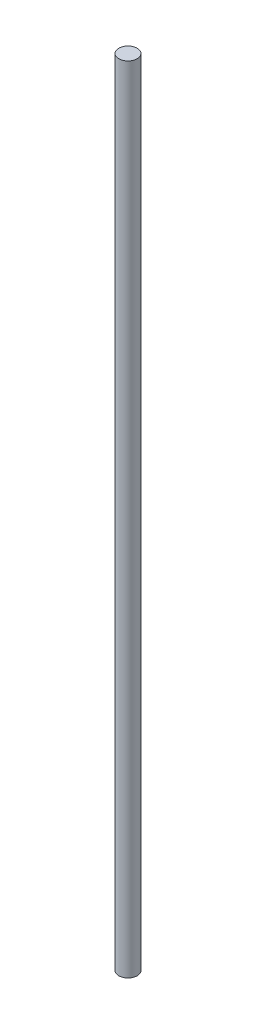
ISO-10303-21;
HEADER;
FILE_DESCRIPTION(('STEP AP214'),'2;1');
FILE_NAME('part.step','',(''),(''),'','','');
FILE_SCHEMA(('AUTOMOTIVE_DESIGN { 1 0 10303 214 1 1 1 1 }'));
ENDSEC;
DATA;
#1=APPLICATION_CONTEXT('core data for automotive mechanical design processes');
#2=APPLICATION_PROTOCOL_DEFINITION('international standard','automotive_design',2000,#1);
#3=PRODUCT_CONTEXT('',#1,'mechanical');
#4=PRODUCT('Part','Part','',(#3));
#5=PRODUCT_RELATED_PRODUCT_CATEGORY('part','',(#4));
#6=PRODUCT_DEFINITION_FORMATION('','',#4);
#7=PRODUCT_DEFINITION_CONTEXT('part definition',#1,'design');
#8=PRODUCT_DEFINITION('design','',#6,#7);
#9=PRODUCT_DEFINITION_SHAPE('','',#8);
#10=(LENGTH_UNIT() NAMED_UNIT(*) SI_UNIT(.MILLI.,.METRE.));
#11=(NAMED_UNIT(*) PLANE_ANGLE_UNIT() SI_UNIT($,.RADIAN.));
#12=(NAMED_UNIT(*) SI_UNIT($,.STERADIAN.) SOLID_ANGLE_UNIT());
#13=UNCERTAINTY_MEASURE_WITH_UNIT(LENGTH_MEASURE(1.E-05),#10,'distance_accuracy_value','');
#14=(GEOMETRIC_REPRESENTATION_CONTEXT(3) GLOBAL_UNCERTAINTY_ASSIGNED_CONTEXT((#13)) GLOBAL_UNIT_ASSIGNED_CONTEXT((#10,
#11,#12)) REPRESENTATION_CONTEXT('',''));
#15=CARTESIAN_POINT('',(0.,0.,0.));
#16=DIRECTION('',(0.,0.,1.));
#17=DIRECTION('',(1.,0.,0.));
#18=AXIS2_PLACEMENT_3D('',#15,#16,#17);
#19=CARTESIAN_POINT('',(0.,260.,0.));
#20=DIRECTION('',(0.,-1.,0.));
#21=DIRECTION('',(0.,0.,-1.));
#22=AXIS2_PLACEMENT_3D('',#19,#20,#21);
#23=CYLINDRICAL_SURFACE('',#22,3.);
#24=CARTESIAN_POINT('',(0.,260.,0.));
#25=DIRECTION('',(0.,1.,0.));
#26=DIRECTION('',(0.,0.,1.));
#27=AXIS2_PLACEMENT_3D('',#24,#25,#26);
#28=CIRCLE('',#27,3.);
#29=CARTESIAN_POINT('',(0.,260.,3.));
#30=VERTEX_POINT('',#29);
#31=EDGE_CURVE('E10',#30,#30,#28,.T.);
#32=ORIENTED_EDGE('',*,*,#31,.F.);
#33=EDGE_LOOP('',(#32));
#34=FACE_BOUND('',#33,.T.);
#35=CARTESIAN_POINT('',(0.,0.,0.));
#36=DIRECTION('',(0.,1.,0.));
#37=DIRECTION('',(0.,0.,1.));
#38=AXIS2_PLACEMENT_3D('',#35,#36,#37);
#39=CIRCLE('',#38,3.);
#40=CARTESIAN_POINT('',(0.,0.,3.));
#41=VERTEX_POINT('',#40);
#42=EDGE_CURVE('E38',#41,#41,#39,.T.);
#43=ORIENTED_EDGE('',*,*,#42,.T.);
#44=EDGE_LOOP('',(#43));
#45=FACE_BOUND('',#44,.T.);
#46=ADVANCED_FACE('F35',(#34,#45),#23,.T.);
#47=CARTESIAN_POINT('',(0.,260.,0.));
#48=DIRECTION('',(0.,1.,0.));
#49=DIRECTION('',(0.,0.,1.));
#50=AXIS2_PLACEMENT_3D('',#47,#48,#49);
#51=PLANE('',#50);
#52=ORIENTED_EDGE('',*,*,#31,.T.);
#53=EDGE_LOOP('',(#52));
#54=FACE_BOUND('',#53,.T.);
#55=ADVANCED_FACE('F50',(#54),#51,.T.);
#56=CARTESIAN_POINT('',(0.,0.,0.));
#57=DIRECTION('',(0.,1.,0.));
#58=DIRECTION('',(0.,0.,1.));
#59=AXIS2_PLACEMENT_3D('',#56,#57,#58);
#60=PLANE('',#59);
#61=ORIENTED_EDGE('',*,*,#42,.F.);
#62=EDGE_LOOP('',(#61));
#63=FACE_BOUND('',#62,.T.);
#64=ADVANCED_FACE('F48',(#63),#60,.F.);
#65=CLOSED_SHELL('',(#46,#55,#64));
#66=MANIFOLD_SOLID_BREP('B2',#65);
#67=ADVANCED_BREP_SHAPE_REPRESENTATION('',(#18,#66),#14);
#68=SHAPE_DEFINITION_REPRESENTATION(#9,#67);
ENDSEC;
END-ISO-10303-21;
